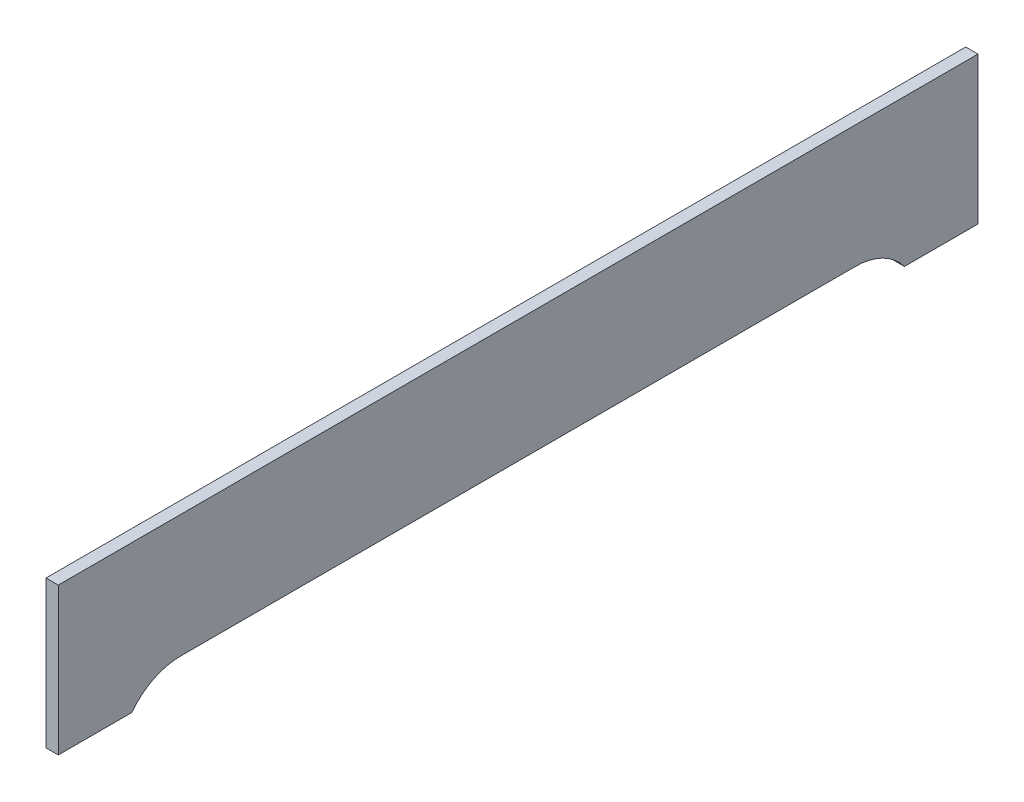
ISO-10303-21;
HEADER;
FILE_DESCRIPTION(('STEP AP214'),'2;1');
FILE_NAME('part.step','',(''),(''),'','','');
FILE_SCHEMA(('AUTOMOTIVE_DESIGN { 1 0 10303 214 1 1 1 1 }'));
ENDSEC;
DATA;
#1=APPLICATION_CONTEXT('core data for automotive mechanical design processes');
#2=APPLICATION_PROTOCOL_DEFINITION('international standard','automotive_design',2000,#1);
#3=PRODUCT_CONTEXT('',#1,'mechanical');
#4=PRODUCT('Part','Part','',(#3));
#5=PRODUCT_RELATED_PRODUCT_CATEGORY('part','',(#4));
#6=PRODUCT_DEFINITION_FORMATION('','',#4);
#7=PRODUCT_DEFINITION_CONTEXT('part definition',#1,'design');
#8=PRODUCT_DEFINITION('design','',#6,#7);
#9=PRODUCT_DEFINITION_SHAPE('','',#8);
#10=(LENGTH_UNIT() NAMED_UNIT(*) SI_UNIT(.MILLI.,.METRE.));
#11=(NAMED_UNIT(*) PLANE_ANGLE_UNIT() SI_UNIT($,.RADIAN.));
#12=(NAMED_UNIT(*) SI_UNIT($,.STERADIAN.) SOLID_ANGLE_UNIT());
#13=UNCERTAINTY_MEASURE_WITH_UNIT(LENGTH_MEASURE(1.E-05),#10,'distance_accuracy_value','');
#14=(GEOMETRIC_REPRESENTATION_CONTEXT(3) GLOBAL_UNCERTAINTY_ASSIGNED_CONTEXT((#13)) GLOBAL_UNIT_ASSIGNED_CONTEXT((#10,
#11,#12)) REPRESENTATION_CONTEXT('',''));
#15=CARTESIAN_POINT('',(0.,0.,0.));
#16=DIRECTION('',(0.,0.,1.));
#17=DIRECTION('',(1.,0.,0.));
#18=AXIS2_PLACEMENT_3D('',#15,#16,#17);
#19=CARTESIAN_POINT('',(5.,0.,0.));
#20=DIRECTION('',(0.,0.,-1.));
#21=DIRECTION('',(0.,1.,0.));
#22=AXIS2_PLACEMENT_3D('',#19,#20,#21);
#23=PLANE('',#22);
#24=DIRECTION('',(0.,-1.,0.));
#25=VECTOR('',#24,1.);
#26=CARTESIAN_POINT('',(0.,0.,0.));
#27=LINE('',#26,#25);
#28=CARTESIAN_POINT('',(0.,50.,0.));
#29=VERTEX_POINT('',#28);
#30=CARTESIAN_POINT('',(0.,-10.,0.));
#31=VERTEX_POINT('',#30);
#32=EDGE_CURVE('E91',#29,#31,#27,.T.);
#33=ORIENTED_EDGE('',*,*,#32,.T.);
#34=DIRECTION('',(-1.,0.,0.));
#35=VECTOR('',#34,1.);
#36=CARTESIAN_POINT('',(5.,-10.,0.));
#37=LINE('',#36,#35);
#38=CARTESIAN_POINT('',(5.,-10.,0.));
#39=VERTEX_POINT('',#38);
#40=EDGE_CURVE('E11',#39,#31,#37,.T.);
#41=ORIENTED_EDGE('',*,*,#40,.F.);
#42=DIRECTION('',(0.,-1.,0.));
#43=VECTOR('',#42,1.);
#44=CARTESIAN_POINT('',(5.,0.,0.));
#45=LINE('',#44,#43);
#46=CARTESIAN_POINT('',(5.,50.,0.));
#47=VERTEX_POINT('',#46);
#48=EDGE_CURVE('E97',#47,#39,#45,.T.);
#49=ORIENTED_EDGE('',*,*,#48,.F.);
#50=DIRECTION('',(-1.,0.,0.));
#51=VECTOR('',#50,1.);
#52=CARTESIAN_POINT('',(5.,50.,0.));
#53=LINE('',#52,#51);
#54=EDGE_CURVE('E136',#47,#29,#53,.T.);
#55=ORIENTED_EDGE('',*,*,#54,.T.);
#56=EDGE_LOOP('',(#33,#41,#49,#55));
#57=FACE_BOUND('',#56,.T.);
#58=ADVANCED_FACE('F39',(#57),#23,.F.);
#59=CARTESIAN_POINT('',(5.,-10.,0.));
#60=DIRECTION('',(0.,1.,0.));
#61=DIRECTION('',(0.,0.,1.));
#62=AXIS2_PLACEMENT_3D('',#59,#60,#61);
#63=PLANE('',#62);
#64=DIRECTION('',(0.,0.,-1.));
#65=VECTOR('',#64,1.);
#66=CARTESIAN_POINT('',(0.,-10.,0.));
#67=LINE('',#66,#65);
#68=CARTESIAN_POINT('',(0.,-10.,-30.));
#69=VERTEX_POINT('',#68);
#70=EDGE_CURVE('E142',#31,#69,#67,.T.);
#71=ORIENTED_EDGE('',*,*,#70,.T.);
#72=DIRECTION('',(-1.,0.,0.));
#73=VECTOR('',#72,1.);
#74=CARTESIAN_POINT('',(5.,-10.,-30.));
#75=LINE('',#74,#73);
#76=CARTESIAN_POINT('',(5.,-10.,-30.));
#77=VERTEX_POINT('',#76);
#78=EDGE_CURVE('E48',#77,#69,#75,.T.);
#79=ORIENTED_EDGE('',*,*,#78,.F.);
#80=DIRECTION('',(0.,0.,-1.));
#81=VECTOR('',#80,1.);
#82=CARTESIAN_POINT('',(5.,-10.,0.));
#83=LINE('',#82,#81);
#84=EDGE_CURVE('E202',#39,#77,#83,.T.);
#85=ORIENTED_EDGE('',*,*,#84,.F.);
#86=ORIENTED_EDGE('',*,*,#40,.T.);
#87=EDGE_LOOP('',(#71,#79,#85,#86));
#88=FACE_BOUND('',#87,.T.);
#89=ADVANCED_FACE('F206',(#88),#63,.F.);
#90=CARTESIAN_POINT('',(5.,-25.,-50.));
#91=DIRECTION('',(-1.,0.,0.));
#92=DIRECTION('',(0.,0.,1.));
#93=AXIS2_PLACEMENT_3D('',#90,#91,#92);
#94=CYLINDRICAL_SURFACE('',#93,25.);
#95=CARTESIAN_POINT('',(0.,-25.,-50.));
#96=DIRECTION('',(-1.,0.,0.));
#97=DIRECTION('',(0.,0.,1.));
#98=AXIS2_PLACEMENT_3D('',#95,#96,#97);
#99=CIRCLE('',#98,25.);
#100=CARTESIAN_POINT('',(0.,0.,-50.));
#101=VERTEX_POINT('',#100);
#102=EDGE_CURVE('E145',#69,#101,#99,.T.);
#103=ORIENTED_EDGE('',*,*,#102,.T.);
#104=DIRECTION('',(-1.,0.,0.));
#105=VECTOR('',#104,1.);
#106=CARTESIAN_POINT('',(5.,0.,-50.));
#107=LINE('',#106,#105);
#108=CARTESIAN_POINT('',(5.,0.,-50.));
#109=VERTEX_POINT('',#108);
#110=EDGE_CURVE('E172',#109,#101,#107,.T.);
#111=ORIENTED_EDGE('',*,*,#110,.F.);
#112=CARTESIAN_POINT('',(5.,-25.,-50.));
#113=DIRECTION('',(-1.,0.,0.));
#114=DIRECTION('',(0.,0.,1.));
#115=AXIS2_PLACEMENT_3D('',#112,#113,#114);
#116=CIRCLE('',#115,25.);
#117=EDGE_CURVE('E183',#77,#109,#116,.T.);
#118=ORIENTED_EDGE('',*,*,#117,.F.);
#119=ORIENTED_EDGE('',*,*,#78,.T.);
#120=EDGE_LOOP('',(#103,#111,#118,#119));
#121=FACE_BOUND('',#120,.T.);
#122=ADVANCED_FACE('F181',(#121),#94,.F.);
#123=CARTESIAN_POINT('',(5.,0.,-50.));
#124=DIRECTION('',(0.,1.,0.));
#125=DIRECTION('',(0.,0.,1.));
#126=AXIS2_PLACEMENT_3D('',#123,#124,#125);
#127=PLANE('',#126);
#128=DIRECTION('',(0.,0.,-1.));
#129=VECTOR('',#128,1.);
#130=CARTESIAN_POINT('',(0.,0.,-50.));
#131=LINE('',#130,#129);
#132=CARTESIAN_POINT('',(0.,0.,-325.));
#133=VERTEX_POINT('',#132);
#134=EDGE_CURVE('E148',#101,#133,#131,.T.);
#135=ORIENTED_EDGE('',*,*,#134,.T.);
#136=DIRECTION('',(-1.,0.,0.));
#137=VECTOR('',#136,1.);
#138=CARTESIAN_POINT('',(5.,0.,-325.));
#139=LINE('',#138,#137);
#140=CARTESIAN_POINT('',(5.,0.,-325.));
#141=VERTEX_POINT('',#140);
#142=EDGE_CURVE('E168',#141,#133,#139,.T.);
#143=ORIENTED_EDGE('',*,*,#142,.F.);
#144=DIRECTION('',(0.,0.,-1.));
#145=VECTOR('',#144,1.);
#146=CARTESIAN_POINT('',(5.,0.,-50.));
#147=LINE('',#146,#145);
#148=EDGE_CURVE('E196',#109,#141,#147,.T.);
#149=ORIENTED_EDGE('',*,*,#148,.F.);
#150=ORIENTED_EDGE('',*,*,#110,.T.);
#151=EDGE_LOOP('',(#135,#143,#149,#150));
#152=FACE_BOUND('',#151,.T.);
#153=ADVANCED_FACE('F191',(#152),#127,.F.);
#154=CARTESIAN_POINT('',(5.,-25.,-325.));
#155=DIRECTION('',(-1.,0.,0.));
#156=DIRECTION('',(0.,0.,1.));
#157=AXIS2_PLACEMENT_3D('',#154,#155,#156);
#158=CYLINDRICAL_SURFACE('',#157,25.);
#159=CARTESIAN_POINT('',(0.,-25.,-325.));
#160=DIRECTION('',(-1.,0.,0.));
#161=DIRECTION('',(0.,0.,-1.));
#162=AXIS2_PLACEMENT_3D('',#159,#160,#161);
#163=CIRCLE('',#162,25.);
#164=CARTESIAN_POINT('',(0.,-10.,-345.));
#165=VERTEX_POINT('',#164);
#166=EDGE_CURVE('E151',#133,#165,#163,.T.);
#167=ORIENTED_EDGE('',*,*,#166,.T.);
#168=DIRECTION('',(-1.,0.,0.));
#169=VECTOR('',#168,1.);
#170=CARTESIAN_POINT('',(5.,-10.,-345.));
#171=LINE('',#170,#169);
#172=CARTESIAN_POINT('',(5.,-10.,-345.));
#173=VERTEX_POINT('',#172);
#174=EDGE_CURVE('E129',#173,#165,#171,.T.);
#175=ORIENTED_EDGE('',*,*,#174,.F.);
#176=CARTESIAN_POINT('',(5.,-25.,-325.));
#177=DIRECTION('',(-1.,0.,0.));
#178=DIRECTION('',(0.,0.,-1.));
#179=AXIS2_PLACEMENT_3D('',#176,#177,#178);
#180=CIRCLE('',#179,25.);
#181=EDGE_CURVE('E117',#141,#173,#180,.T.);
#182=ORIENTED_EDGE('',*,*,#181,.F.);
#183=ORIENTED_EDGE('',*,*,#142,.T.);
#184=EDGE_LOOP('',(#167,#175,#182,#183));
#185=FACE_BOUND('',#184,.T.);
#186=ADVANCED_FACE('F194',(#185),#158,.F.);
#187=CARTESIAN_POINT('',(5.,-10.,-375.));
#188=DIRECTION('',(0.,1.,0.));
#189=DIRECTION('',(0.,0.,1.));
#190=AXIS2_PLACEMENT_3D('',#187,#188,#189);
#191=PLANE('',#190);
#192=DIRECTION('',(0.,0.,-1.));
#193=VECTOR('',#192,1.);
#194=CARTESIAN_POINT('',(0.,-10.,-375.));
#195=LINE('',#194,#193);
#196=CARTESIAN_POINT('',(0.,-10.,-375.));
#197=VERTEX_POINT('',#196);
#198=EDGE_CURVE('E127',#165,#197,#195,.T.);
#199=ORIENTED_EDGE('',*,*,#198,.T.);
#200=DIRECTION('',(-1.,0.,0.));
#201=VECTOR('',#200,1.);
#202=CARTESIAN_POINT('',(5.,-10.,-375.));
#203=LINE('',#202,#201);
#204=CARTESIAN_POINT('',(5.,-10.,-375.));
#205=VERTEX_POINT('',#204);
#206=EDGE_CURVE('E124',#205,#197,#203,.T.);
#207=ORIENTED_EDGE('',*,*,#206,.F.);
#208=DIRECTION('',(0.,0.,-1.));
#209=VECTOR('',#208,1.);
#210=CARTESIAN_POINT('',(5.,-10.,-375.));
#211=LINE('',#210,#209);
#212=EDGE_CURVE('E111',#173,#205,#211,.T.);
#213=ORIENTED_EDGE('',*,*,#212,.F.);
#214=ORIENTED_EDGE('',*,*,#174,.T.);
#215=EDGE_LOOP('',(#199,#207,#213,#214));
#216=FACE_BOUND('',#215,.T.);
#217=ADVANCED_FACE('F125',(#216),#191,.F.);
#218=CARTESIAN_POINT('',(5.,0.,-375.));
#219=DIRECTION('',(0.,0.,1.));
#220=DIRECTION('',(1.,0.,0.));
#221=AXIS2_PLACEMENT_3D('',#218,#219,#220);
#222=PLANE('',#221);
#223=DIRECTION('',(0.,1.,0.));
#224=VECTOR('',#223,1.);
#225=CARTESIAN_POINT('',(0.,0.,-375.));
#226=LINE('',#225,#224);
#227=CARTESIAN_POINT('',(0.,50.,-375.));
#228=VERTEX_POINT('',#227);
#229=EDGE_CURVE('E84',#197,#228,#226,.T.);
#230=ORIENTED_EDGE('',*,*,#229,.T.);
#231=DIRECTION('',(-1.,0.,0.));
#232=VECTOR('',#231,1.);
#233=CARTESIAN_POINT('',(5.,50.,-375.));
#234=LINE('',#233,#232);
#235=CARTESIAN_POINT('',(5.,50.,-375.));
#236=VERTEX_POINT('',#235);
#237=EDGE_CURVE('E130',#236,#228,#234,.T.);
#238=ORIENTED_EDGE('',*,*,#237,.F.);
#239=DIRECTION('',(0.,1.,0.));
#240=VECTOR('',#239,1.);
#241=CARTESIAN_POINT('',(5.,0.,-375.));
#242=LINE('',#241,#240);
#243=EDGE_CURVE('E115',#205,#236,#242,.T.);
#244=ORIENTED_EDGE('',*,*,#243,.F.);
#245=ORIENTED_EDGE('',*,*,#206,.T.);
#246=EDGE_LOOP('',(#230,#238,#244,#245));
#247=FACE_BOUND('',#246,.T.);
#248=ADVANCED_FACE('F132',(#247),#222,.F.);
#249=CARTESIAN_POINT('',(5.,50.,0.));
#250=DIRECTION('',(0.,-1.,0.));
#251=DIRECTION('',(0.,0.,-1.));
#252=AXIS2_PLACEMENT_3D('',#249,#250,#251);
#253=PLANE('',#252);
#254=DIRECTION('',(0.,0.,1.));
#255=VECTOR('',#254,1.);
#256=CARTESIAN_POINT('',(0.,50.,0.));
#257=LINE('',#256,#255);
#258=EDGE_CURVE('E158',#228,#29,#257,.T.);
#259=ORIENTED_EDGE('',*,*,#258,.T.);
#260=ORIENTED_EDGE('',*,*,#54,.F.);
#261=DIRECTION('',(0.,0.,1.));
#262=VECTOR('',#261,1.);
#263=CARTESIAN_POINT('',(5.,50.,0.));
#264=LINE('',#263,#262);
#265=EDGE_CURVE('E56',#236,#47,#264,.T.);
#266=ORIENTED_EDGE('',*,*,#265,.F.);
#267=ORIENTED_EDGE('',*,*,#237,.T.);
#268=EDGE_LOOP('',(#259,#260,#266,#267));
#269=FACE_BOUND('',#268,.T.);
#270=ADVANCED_FACE('F209',(#269),#253,.F.);
#271=CARTESIAN_POINT('',(5.,-25.,-325.));
#272=DIRECTION('',(1.,0.,0.));
#273=DIRECTION('',(0.,0.,-1.));
#274=AXIS2_PLACEMENT_3D('',#271,#272,#273);
#275=PLANE('',#274);
#276=ORIENTED_EDGE('',*,*,#48,.T.);
#277=ORIENTED_EDGE('',*,*,#84,.T.);
#278=ORIENTED_EDGE('',*,*,#117,.T.);
#279=ORIENTED_EDGE('',*,*,#148,.T.);
#280=ORIENTED_EDGE('',*,*,#181,.T.);
#281=ORIENTED_EDGE('',*,*,#212,.T.);
#282=ORIENTED_EDGE('',*,*,#243,.T.);
#283=ORIENTED_EDGE('',*,*,#265,.T.);
#284=EDGE_LOOP('',(#276,#277,#278,#279,#280,#281,#282,#283));
#285=FACE_BOUND('',#284,.T.);
#286=ADVANCED_FACE('F113',(#285),#275,.T.);
#287=CARTESIAN_POINT('',(0.,-25.,-325.));
#288=DIRECTION('',(1.,0.,0.));
#289=DIRECTION('',(0.,0.,-1.));
#290=AXIS2_PLACEMENT_3D('',#287,#288,#289);
#291=PLANE('',#290);
#292=ORIENTED_EDGE('',*,*,#32,.F.);
#293=ORIENTED_EDGE('',*,*,#258,.F.);
#294=ORIENTED_EDGE('',*,*,#229,.F.);
#295=ORIENTED_EDGE('',*,*,#198,.F.);
#296=ORIENTED_EDGE('',*,*,#166,.F.);
#297=ORIENTED_EDGE('',*,*,#134,.F.);
#298=ORIENTED_EDGE('',*,*,#102,.F.);
#299=ORIENTED_EDGE('',*,*,#70,.F.);
#300=EDGE_LOOP('',(#292,#293,#294,#295,#296,#297,#298,#299));
#301=FACE_BOUND('',#300,.T.);
#302=ADVANCED_FACE('F187',(#301),#291,.F.);
#303=CLOSED_SHELL('',(#58,#89,#122,#153,#186,#217,#248,#270,#286,#302));
#304=MANIFOLD_SOLID_BREP('B2',#303);
#305=ADVANCED_BREP_SHAPE_REPRESENTATION('',(#18,#304),#14);
#306=SHAPE_DEFINITION_REPRESENTATION(#9,#305);
ENDSEC;
END-ISO-10303-21;
